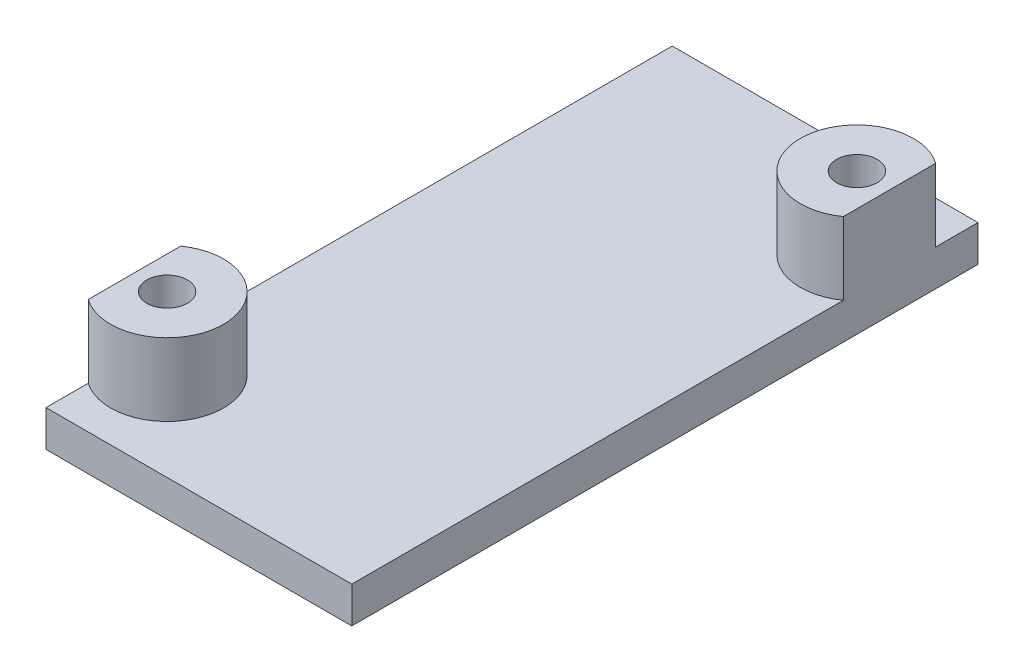
ISO-10303-21;
HEADER;
FILE_DESCRIPTION(('STEP AP214'),'2;1');
FILE_NAME('part.step','',(''),(''),'','','');
FILE_SCHEMA(('AUTOMOTIVE_DESIGN { 1 0 10303 214 1 1 1 1 }'));
ENDSEC;
DATA;
#1=APPLICATION_CONTEXT('core data for automotive mechanical design processes');
#2=APPLICATION_PROTOCOL_DEFINITION('international standard','automotive_design',2000,#1);
#3=PRODUCT_CONTEXT('',#1,'mechanical');
#4=PRODUCT('Part','Part','',(#3));
#5=PRODUCT_RELATED_PRODUCT_CATEGORY('part','',(#4));
#6=PRODUCT_DEFINITION_FORMATION('','',#4);
#7=PRODUCT_DEFINITION_CONTEXT('part definition',#1,'design');
#8=PRODUCT_DEFINITION('design','',#6,#7);
#9=PRODUCT_DEFINITION_SHAPE('','',#8);
#10=(LENGTH_UNIT() NAMED_UNIT(*) SI_UNIT(.MILLI.,.METRE.));
#11=(NAMED_UNIT(*) PLANE_ANGLE_UNIT() SI_UNIT($,.RADIAN.));
#12=(NAMED_UNIT(*) SI_UNIT($,.STERADIAN.) SOLID_ANGLE_UNIT());
#13=UNCERTAINTY_MEASURE_WITH_UNIT(LENGTH_MEASURE(1.E-05),#10,'distance_accuracy_value','');
#14=(GEOMETRIC_REPRESENTATION_CONTEXT(3) GLOBAL_UNCERTAINTY_ASSIGNED_CONTEXT((#13)) GLOBAL_UNIT_ASSIGNED_CONTEXT((#10,
#11,#12)) REPRESENTATION_CONTEXT('',''));
#15=CARTESIAN_POINT('',(0.,0.,0.));
#16=DIRECTION('',(0.,0.,1.));
#17=DIRECTION('',(1.,0.,0.));
#18=AXIS2_PLACEMENT_3D('',#15,#16,#17);
#19=CARTESIAN_POINT('',(10.541,2.5,-21.5899999999999));
#20=DIRECTION('',(-1.,0.,0.));
#21=DIRECTION('',(0.,0.,1.));
#22=AXIS2_PLACEMENT_3D('',#19,#20,#21);
#23=PLANE('',#22);
#24=DIRECTION('',(0.,0.,-1.));
#25=VECTOR('',#24,1.);
#26=CARTESIAN_POINT('',(10.541,0.,-21.5899999999999));
#27=LINE('',#26,#25);
#28=CARTESIAN_POINT('',(10.541,0.,21.5900000000001));
#29=VERTEX_POINT('',#28);
#30=CARTESIAN_POINT('',(10.541,0.,-21.5899999999999));
#31=VERTEX_POINT('',#30);
#32=EDGE_CURVE('E139',#29,#31,#27,.T.);
#33=ORIENTED_EDGE('',*,*,#32,.T.);
#34=DIRECTION('',(0.,-1.,0.));
#35=VECTOR('',#34,1.);
#36=CARTESIAN_POINT('',(10.541,2.5,-21.5899999999999));
#37=LINE('',#36,#35);
#38=CARTESIAN_POINT('',(10.541,2.5,-21.5899999999999));
#39=VERTEX_POINT('',#38);
#40=EDGE_CURVE('E45',#39,#31,#37,.T.);
#41=ORIENTED_EDGE('',*,*,#40,.F.);
#42=DIRECTION('',(0.,0.,-1.));
#43=VECTOR('',#42,1.);
#44=CARTESIAN_POINT('',(10.541,2.5,-21.5899999999999));
#45=LINE('',#44,#43);
#46=CARTESIAN_POINT('',(10.541,2.5,-18.6755140872392));
#47=VERTEX_POINT('',#46);
#48=EDGE_CURVE('E116',#47,#39,#45,.T.);
#49=ORIENTED_EDGE('',*,*,#48,.F.);
#50=DIRECTION('',(0.,-1.,0.));
#51=VECTOR('',#50,1.);
#52=CARTESIAN_POINT('',(10.541,7.5,-18.6755140872392));
#53=LINE('',#52,#51);
#54=CARTESIAN_POINT('',(10.541,7.5,-18.6755140872392));
#55=VERTEX_POINT('',#54);
#56=EDGE_CURVE('E52',#55,#47,#53,.T.);
#57=ORIENTED_EDGE('',*,*,#56,.F.);
#58=DIRECTION('',(0.,0.,-1.));
#59=VECTOR('',#58,1.);
#60=CARTESIAN_POINT('',(10.541,7.5,0.));
#61=LINE('',#60,#59);
#62=CARTESIAN_POINT('',(10.541,7.5,-12.3044859127606));
#63=VERTEX_POINT('',#62);
#64=EDGE_CURVE('E107',#63,#55,#61,.T.);
#65=ORIENTED_EDGE('',*,*,#64,.F.);
#66=DIRECTION('',(0.,-1.,0.));
#67=VECTOR('',#66,1.);
#68=CARTESIAN_POINT('',(10.541,7.5,-12.3044859127606));
#69=LINE('',#68,#67);
#70=CARTESIAN_POINT('',(10.541,2.5,-12.3044859127606));
#71=VERTEX_POINT('',#70);
#72=EDGE_CURVE('E104',#63,#71,#69,.T.);
#73=ORIENTED_EDGE('',*,*,#72,.T.);
#74=CARTESIAN_POINT('',(10.541,2.5,21.5900000000001));
#75=VERTEX_POINT('',#74);
#76=EDGE_CURVE('E140',#75,#71,#45,.T.);
#77=ORIENTED_EDGE('',*,*,#76,.F.);
#78=DIRECTION('',(0.,-1.,0.));
#79=VECTOR('',#78,1.);
#80=CARTESIAN_POINT('',(10.541,2.5,21.5900000000001));
#81=LINE('',#80,#79);
#82=EDGE_CURVE('E150',#75,#29,#81,.T.);
#83=ORIENTED_EDGE('',*,*,#82,.T.);
#84=EDGE_LOOP('',(#33,#41,#49,#57,#65,#73,#77,#83));
#85=FACE_BOUND('',#84,.T.);
#86=ADVANCED_FACE('F38',(#85),#23,.F.);
#87=CARTESIAN_POINT('',(-10.541,2.5,-21.5899999999999));
#88=DIRECTION('',(0.,0.,1.));
#89=DIRECTION('',(1.,0.,0.));
#90=AXIS2_PLACEMENT_3D('',#87,#88,#89);
#91=PLANE('',#90);
#92=DIRECTION('',(-1.,0.,0.));
#93=VECTOR('',#92,1.);
#94=CARTESIAN_POINT('',(-10.541,0.,-21.5899999999999));
#95=LINE('',#94,#93);
#96=CARTESIAN_POINT('',(-10.541,0.,-21.5899999999999));
#97=VERTEX_POINT('',#96);
#98=EDGE_CURVE('E152',#31,#97,#95,.T.);
#99=ORIENTED_EDGE('',*,*,#98,.T.);
#100=DIRECTION('',(0.,-1.,0.));
#101=VECTOR('',#100,1.);
#102=CARTESIAN_POINT('',(-10.541,2.5,-21.5899999999999));
#103=LINE('',#102,#101);
#104=CARTESIAN_POINT('',(-10.541,2.5,-21.5899999999999));
#105=VERTEX_POINT('',#104);
#106=EDGE_CURVE('E163',#105,#97,#103,.T.);
#107=ORIENTED_EDGE('',*,*,#106,.F.);
#108=DIRECTION('',(-1.,0.,0.));
#109=VECTOR('',#108,1.);
#110=CARTESIAN_POINT('',(-10.541,2.5,-21.5899999999999));
#111=LINE('',#110,#109);
#112=EDGE_CURVE('E143',#39,#105,#111,.T.);
#113=ORIENTED_EDGE('',*,*,#112,.F.);
#114=ORIENTED_EDGE('',*,*,#40,.T.);
#115=EDGE_LOOP('',(#99,#107,#113,#114));
#116=FACE_BOUND('',#115,.T.);
#117=ADVANCED_FACE('F168',(#116),#91,.F.);
#118=CARTESIAN_POINT('',(-10.541,2.5,-21.5899999999999));
#119=DIRECTION('',(1.,0.,0.));
#120=DIRECTION('',(0.,0.,-1.));
#121=AXIS2_PLACEMENT_3D('',#118,#119,#120);
#122=PLANE('',#121);
#123=DIRECTION('',(0.,0.,1.));
#124=VECTOR('',#123,1.);
#125=CARTESIAN_POINT('',(-10.541,0.,-21.5899999999999));
#126=LINE('',#125,#124);
#127=CARTESIAN_POINT('',(-10.541,0.,21.5900000000001));
#128=VERTEX_POINT('',#127);
#129=EDGE_CURVE('E154',#97,#128,#126,.T.);
#130=ORIENTED_EDGE('',*,*,#129,.T.);
#131=DIRECTION('',(0.,-1.,0.));
#132=VECTOR('',#131,1.);
#133=CARTESIAN_POINT('',(-10.541,2.5,21.5900000000001));
#134=LINE('',#133,#132);
#135=CARTESIAN_POINT('',(-10.541,2.5,21.5900000000001));
#136=VERTEX_POINT('',#135);
#137=EDGE_CURVE('E160',#136,#128,#134,.T.);
#138=ORIENTED_EDGE('',*,*,#137,.F.);
#139=DIRECTION('',(0.,0.,1.));
#140=VECTOR('',#139,1.);
#141=CARTESIAN_POINT('',(-10.541,2.5,-21.5899999999999));
#142=LINE('',#141,#140);
#143=CARTESIAN_POINT('',(-10.541,2.5,18.6755140872394));
#144=VERTEX_POINT('',#143);
#145=EDGE_CURVE('E145',#144,#136,#142,.T.);
#146=ORIENTED_EDGE('',*,*,#145,.F.);
#147=DIRECTION('',(0.,-1.,0.));
#148=VECTOR('',#147,1.);
#149=CARTESIAN_POINT('',(-10.541,7.5,18.6755140872394));
#150=LINE('',#149,#148);
#151=CARTESIAN_POINT('',(-10.541,7.5,18.6755140872394));
#152=VERTEX_POINT('',#151);
#153=EDGE_CURVE('E136',#152,#144,#150,.T.);
#154=ORIENTED_EDGE('',*,*,#153,.F.);
#155=DIRECTION('',(0.,0.,1.));
#156=VECTOR('',#155,1.);
#157=CARTESIAN_POINT('',(-10.541,7.5,0.));
#158=LINE('',#157,#156);
#159=CARTESIAN_POINT('',(-10.541,7.5,12.3044859127608));
#160=VERTEX_POINT('',#159);
#161=EDGE_CURVE('E127',#160,#152,#158,.T.);
#162=ORIENTED_EDGE('',*,*,#161,.F.);
#163=DIRECTION('',(0.,-1.,0.));
#164=VECTOR('',#163,1.);
#165=CARTESIAN_POINT('',(-10.541,7.5,12.3044859127608));
#166=LINE('',#165,#164);
#167=CARTESIAN_POINT('',(-10.541,2.5,12.3044859127608));
#168=VERTEX_POINT('',#167);
#169=EDGE_CURVE('E131',#160,#168,#166,.T.);
#170=ORIENTED_EDGE('',*,*,#169,.T.);
#171=EDGE_CURVE('E146',#105,#168,#142,.T.);
#172=ORIENTED_EDGE('',*,*,#171,.F.);
#173=ORIENTED_EDGE('',*,*,#106,.T.);
#174=EDGE_LOOP('',(#130,#138,#146,#154,#162,#170,#172,#173));
#175=FACE_BOUND('',#174,.T.);
#176=ADVANCED_FACE('F179',(#175),#122,.F.);
#177=CARTESIAN_POINT('',(-10.541,2.5,21.5900000000001));
#178=DIRECTION('',(0.,0.,-1.));
#179=DIRECTION('',(-1.,0.,0.));
#180=AXIS2_PLACEMENT_3D('',#177,#178,#179);
#181=PLANE('',#180);
#182=DIRECTION('',(1.,0.,0.));
#183=VECTOR('',#182,1.);
#184=CARTESIAN_POINT('',(-10.541,0.,21.5900000000001));
#185=LINE('',#184,#183);
#186=EDGE_CURVE('E156',#128,#29,#185,.T.);
#187=ORIENTED_EDGE('',*,*,#186,.T.);
#188=ORIENTED_EDGE('',*,*,#82,.F.);
#189=DIRECTION('',(1.,0.,0.));
#190=VECTOR('',#189,1.);
#191=CARTESIAN_POINT('',(-10.541,2.5,21.5900000000001));
#192=LINE('',#191,#190);
#193=EDGE_CURVE('E148',#136,#75,#192,.T.);
#194=ORIENTED_EDGE('',*,*,#193,.F.);
#195=ORIENTED_EDGE('',*,*,#137,.T.);
#196=EDGE_LOOP('',(#187,#188,#194,#195));
#197=FACE_BOUND('',#196,.T.);
#198=ADVANCED_FACE('F183',(#197),#181,.F.);
#199=CARTESIAN_POINT('',(0.,2.5,0.));
#200=DIRECTION('',(0.,1.,0.));
#201=DIRECTION('',(0.,0.,1.));
#202=AXIS2_PLACEMENT_3D('',#199,#200,#201);
#203=PLANE('',#202);
#204=ORIENTED_EDGE('',*,*,#76,.T.);
#205=CARTESIAN_POINT('',(8.29100000000002,2.5,-15.4899999999999));
#206=DIRECTION('',(0.,1.,0.));
#207=DIRECTION('',(0.,0.,1.));
#208=AXIS2_PLACEMENT_3D('',#205,#206,#207);
#209=CIRCLE('',#208,3.9);
#210=EDGE_CURVE('E192',#47,#71,#209,.T.);
#211=ORIENTED_EDGE('',*,*,#210,.F.);
#212=ORIENTED_EDGE('',*,*,#48,.T.);
#213=ORIENTED_EDGE('',*,*,#112,.T.);
#214=ORIENTED_EDGE('',*,*,#171,.T.);
#215=CARTESIAN_POINT('',(-8.29099999999997,2.5,15.4900000000001));
#216=DIRECTION('',(0.,1.,0.));
#217=DIRECTION('',(0.,0.,1.));
#218=AXIS2_PLACEMENT_3D('',#215,#216,#217);
#219=CIRCLE('',#218,3.9);
#220=EDGE_CURVE('E60',#144,#168,#219,.T.);
#221=ORIENTED_EDGE('',*,*,#220,.F.);
#222=ORIENTED_EDGE('',*,*,#145,.T.);
#223=ORIENTED_EDGE('',*,*,#193,.T.);
#224=EDGE_LOOP('',(#204,#211,#212,#213,#214,#221,#222,#223));
#225=FACE_BOUND('',#224,.T.);
#226=ADVANCED_FACE('F184',(#225),#203,.T.);
#227=CARTESIAN_POINT('',(0.,0.,0.));
#228=DIRECTION('',(0.,1.,0.));
#229=DIRECTION('',(0.,0.,1.));
#230=AXIS2_PLACEMENT_3D('',#227,#228,#229);
#231=PLANE('',#230);
#232=ORIENTED_EDGE('',*,*,#32,.F.);
#233=ORIENTED_EDGE('',*,*,#186,.F.);
#234=ORIENTED_EDGE('',*,*,#129,.F.);
#235=ORIENTED_EDGE('',*,*,#98,.F.);
#236=EDGE_LOOP('',(#232,#233,#234,#235));
#237=FACE_BOUND('',#236,.T.);
#238=ADVANCED_FACE('F175',(#237),#231,.F.);
#239=CARTESIAN_POINT('',(-8.29099999999997,7.5,15.4900000000001));
#240=DIRECTION('',(0.,-1.,0.));
#241=DIRECTION('',(0.,0.,-1.));
#242=AXIS2_PLACEMENT_3D('',#239,#240,#241);
#243=CYLINDRICAL_SURFACE('',#242,1.4);
#244=CARTESIAN_POINT('',(-8.29099999999997,7.5,15.4900000000001));
#245=DIRECTION('',(0.,1.,0.));
#246=DIRECTION('',(0.,0.,1.));
#247=AXIS2_PLACEMENT_3D('',#244,#245,#246);
#248=CIRCLE('',#247,1.4);
#249=CARTESIAN_POINT('',(-8.29099999999997,7.5,16.8900000000001));
#250=VERTEX_POINT('',#249);
#251=EDGE_CURVE('E124',#250,#250,#248,.T.);
#252=ORIENTED_EDGE('',*,*,#251,.T.);
#253=EDGE_LOOP('',(#252));
#254=FACE_BOUND('',#253,.T.);
#255=CARTESIAN_POINT('',(-8.29099999999997,2.5,15.4900000000001));
#256=DIRECTION('',(0.,1.,0.));
#257=DIRECTION('',(0.,0.,1.));
#258=AXIS2_PLACEMENT_3D('',#255,#256,#257);
#259=CIRCLE('',#258,1.4);
#260=CARTESIAN_POINT('',(-8.29099999999997,2.5,16.8900000000001));
#261=VERTEX_POINT('',#260);
#262=EDGE_CURVE('E117',#261,#261,#259,.T.);
#263=ORIENTED_EDGE('',*,*,#262,.F.);
#264=EDGE_LOOP('',(#263));
#265=FACE_BOUND('',#264,.T.);
#266=ADVANCED_FACE('F223',(#254,#265),#243,.F.);
#267=CARTESIAN_POINT('',(-8.29099999999997,7.5,15.4900000000001));
#268=DIRECTION('',(0.,-1.,0.));
#269=DIRECTION('',(0.,0.,-1.));
#270=AXIS2_PLACEMENT_3D('',#267,#268,#269);
#271=CYLINDRICAL_SURFACE('',#270,3.9);
#272=ORIENTED_EDGE('',*,*,#220,.T.);
#273=ORIENTED_EDGE('',*,*,#169,.F.);
#274=CARTESIAN_POINT('',(-8.29099999999997,7.5,15.4900000000001));
#275=DIRECTION('',(0.,1.,0.));
#276=DIRECTION('',(0.,0.,1.));
#277=AXIS2_PLACEMENT_3D('',#274,#275,#276);
#278=CIRCLE('',#277,3.9);
#279=EDGE_CURVE('E130',#152,#160,#278,.T.);
#280=ORIENTED_EDGE('',*,*,#279,.F.);
#281=ORIENTED_EDGE('',*,*,#153,.T.);
#282=EDGE_LOOP('',(#272,#273,#280,#281));
#283=FACE_BOUND('',#282,.T.);
#284=ADVANCED_FACE('F188',(#283),#271,.T.);
#285=CARTESIAN_POINT('',(0.,7.5,0.));
#286=DIRECTION('',(0.,1.,0.));
#287=DIRECTION('',(0.,0.,1.));
#288=AXIS2_PLACEMENT_3D('',#285,#286,#287);
#289=PLANE('',#288);
#290=ORIENTED_EDGE('',*,*,#251,.F.);
#291=EDGE_LOOP('',(#290));
#292=FACE_BOUND('',#291,.T.);
#293=ORIENTED_EDGE('',*,*,#161,.T.);
#294=ORIENTED_EDGE('',*,*,#279,.T.);
#295=EDGE_LOOP('',(#293,#294));
#296=FACE_BOUND('',#295,.T.);
#297=ADVANCED_FACE('F191',(#292,#296),#289,.T.);
#298=ORIENTED_EDGE('',*,*,#262,.T.);
#299=EDGE_LOOP('',(#298));
#300=FACE_BOUND('',#299,.T.);
#301=ADVANCED_FACE('F209',(#300),#203,.T.);
#302=CARTESIAN_POINT('',(8.29100000000002,7.5,-15.4899999999999));
#303=DIRECTION('',(0.,-1.,0.));
#304=DIRECTION('',(0.,0.,-1.));
#305=AXIS2_PLACEMENT_3D('',#302,#303,#304);
#306=CYLINDRICAL_SURFACE('',#305,1.4);
#307=CARTESIAN_POINT('',(8.29100000000002,7.5,-15.4899999999999));
#308=DIRECTION('',(0.,1.,0.));
#309=DIRECTION('',(0.,0.,1.));
#310=AXIS2_PLACEMENT_3D('',#307,#308,#309);
#311=CIRCLE('',#310,1.4);
#312=CARTESIAN_POINT('',(8.29100000000002,7.5,-14.0899999999999));
#313=VERTEX_POINT('',#312);
#314=EDGE_CURVE('E111',#313,#313,#311,.T.);
#315=ORIENTED_EDGE('',*,*,#314,.T.);
#316=EDGE_LOOP('',(#315));
#317=FACE_BOUND('',#316,.T.);
#318=CARTESIAN_POINT('',(8.29100000000002,2.5,-15.4899999999999));
#319=DIRECTION('',(0.,1.,0.));
#320=DIRECTION('',(0.,0.,1.));
#321=AXIS2_PLACEMENT_3D('',#318,#319,#320);
#322=CIRCLE('',#321,1.4);
#323=CARTESIAN_POINT('',(8.29100000000002,2.5,-14.0899999999999));
#324=VERTEX_POINT('',#323);
#325=EDGE_CURVE('E11',#324,#324,#322,.F.);
#326=ORIENTED_EDGE('',*,*,#325,.T.);
#327=EDGE_LOOP('',(#326));
#328=FACE_BOUND('',#327,.T.);
#329=ADVANCED_FACE('F197',(#317,#328),#306,.F.);
#330=CARTESIAN_POINT('',(8.29100000000002,7.5,-15.4899999999999));
#331=DIRECTION('',(0.,-1.,0.));
#332=DIRECTION('',(0.,0.,-1.));
#333=AXIS2_PLACEMENT_3D('',#330,#331,#332);
#334=CYLINDRICAL_SURFACE('',#333,3.9);
#335=ORIENTED_EDGE('',*,*,#210,.T.);
#336=ORIENTED_EDGE('',*,*,#72,.F.);
#337=CARTESIAN_POINT('',(8.29100000000002,7.5,-15.4899999999999));
#338=DIRECTION('',(0.,1.,0.));
#339=DIRECTION('',(0.,0.,1.));
#340=AXIS2_PLACEMENT_3D('',#337,#338,#339);
#341=CIRCLE('',#340,3.9);
#342=EDGE_CURVE('E100',#55,#63,#341,.T.);
#343=ORIENTED_EDGE('',*,*,#342,.F.);
#344=ORIENTED_EDGE('',*,*,#56,.T.);
#345=EDGE_LOOP('',(#335,#336,#343,#344));
#346=FACE_BOUND('',#345,.T.);
#347=ADVANCED_FACE('F102',(#346),#334,.T.);
#348=CARTESIAN_POINT('',(0.,7.5,0.));
#349=DIRECTION('',(0.,1.,0.));
#350=DIRECTION('',(0.,0.,1.));
#351=AXIS2_PLACEMENT_3D('',#348,#349,#350);
#352=PLANE('',#351);
#353=ORIENTED_EDGE('',*,*,#314,.F.);
#354=EDGE_LOOP('',(#353));
#355=FACE_BOUND('',#354,.T.);
#356=ORIENTED_EDGE('',*,*,#64,.T.);
#357=ORIENTED_EDGE('',*,*,#342,.T.);
#358=EDGE_LOOP('',(#356,#357));
#359=FACE_BOUND('',#358,.T.);
#360=ADVANCED_FACE('F109',(#355,#359),#352,.T.);
#361=ORIENTED_EDGE('',*,*,#325,.F.);
#362=EDGE_LOOP('',(#361));
#363=FACE_BOUND('',#362,.T.);
#364=ADVANCED_FACE('F201',(#363),#203,.T.);
#365=CLOSED_SHELL('',(#86,#117,#176,#198,#226,#238,#266,#284,#297,#301,#329,#347,#360,#364));
#366=MANIFOLD_SOLID_BREP('B2',#365);
#367=ADVANCED_BREP_SHAPE_REPRESENTATION('',(#18,#366),#14);
#368=SHAPE_DEFINITION_REPRESENTATION(#9,#367);
ENDSEC;
END-ISO-10303-21;
